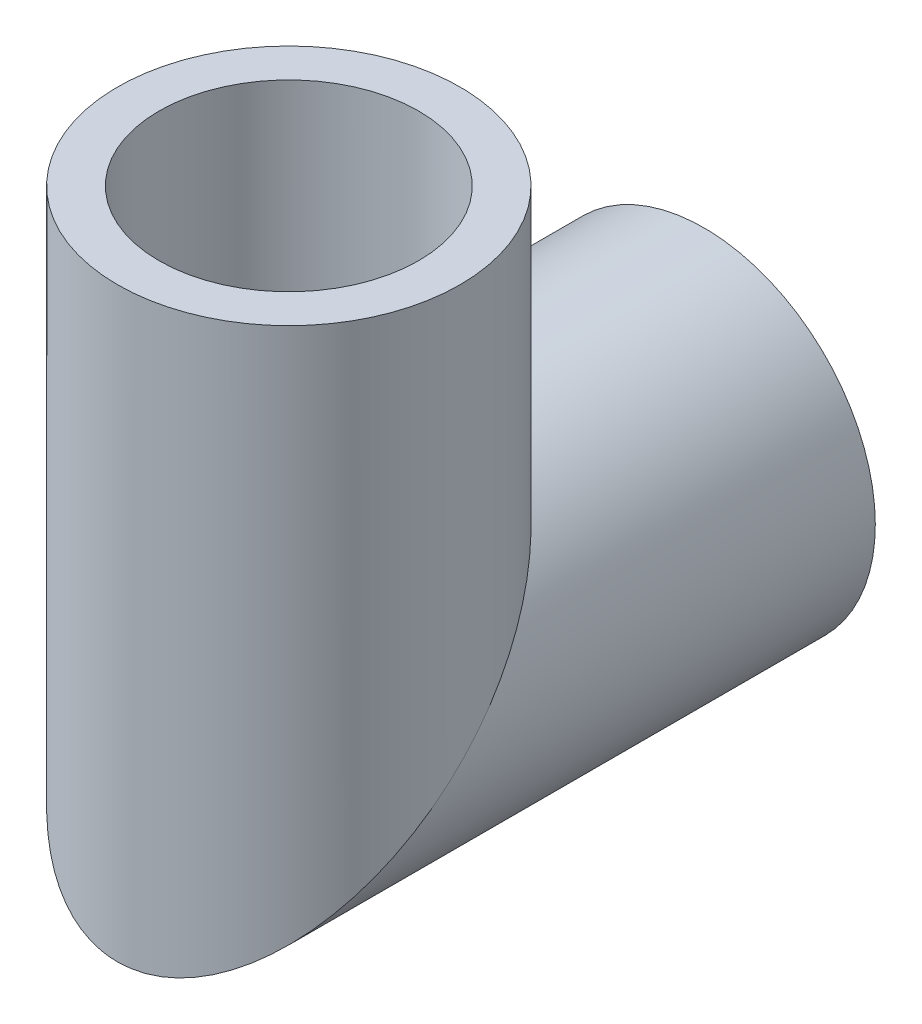
ISO-10303-21;
HEADER;
FILE_DESCRIPTION(('STEP AP214'),'2;1');
FILE_NAME('part.step','',(''),(''),'','','');
FILE_SCHEMA(('AUTOMOTIVE_DESIGN { 1 0 10303 214 1 1 1 1 }'));
ENDSEC;
DATA;
#1=APPLICATION_CONTEXT('core data for automotive mechanical design processes');
#2=APPLICATION_PROTOCOL_DEFINITION('international standard','automotive_design',2000,#1);
#3=PRODUCT_CONTEXT('',#1,'mechanical');
#4=PRODUCT('Part','Part','',(#3));
#5=PRODUCT_RELATED_PRODUCT_CATEGORY('part','',(#4));
#6=PRODUCT_DEFINITION_FORMATION('','',#4);
#7=PRODUCT_DEFINITION_CONTEXT('part definition',#1,'design');
#8=PRODUCT_DEFINITION('design','',#6,#7);
#9=PRODUCT_DEFINITION_SHAPE('','',#8);
#10=(LENGTH_UNIT() NAMED_UNIT(*) SI_UNIT(.MILLI.,.METRE.));
#11=(NAMED_UNIT(*) PLANE_ANGLE_UNIT() SI_UNIT($,.RADIAN.));
#12=(NAMED_UNIT(*) SI_UNIT($,.STERADIAN.) SOLID_ANGLE_UNIT());
#13=UNCERTAINTY_MEASURE_WITH_UNIT(LENGTH_MEASURE(1.E-05),#10,'distance_accuracy_value','');
#14=(GEOMETRIC_REPRESENTATION_CONTEXT(3) GLOBAL_UNCERTAINTY_ASSIGNED_CONTEXT((#13)) GLOBAL_UNIT_ASSIGNED_CONTEXT((#10,
#11,#12)) REPRESENTATION_CONTEXT('',''));
#15=CARTESIAN_POINT('',(0.,0.,0.));
#16=DIRECTION('',(0.,0.,1.));
#17=DIRECTION('',(1.,0.,0.));
#18=AXIS2_PLACEMENT_3D('',#15,#16,#17);
#19=CARTESIAN_POINT('',(0.,40.,40.));
#20=DIRECTION('',(0.,1.,0.));
#21=DIRECTION('',(1.,0.,0.));
#22=AXIS2_PLACEMENT_3D('',#19,#20,#21);
#23=PLANE('',#22);
#24=CARTESIAN_POINT('',(0.,40.,40.));
#25=DIRECTION('',(0.,1.,0.));
#26=DIRECTION('',(0.,0.,1.));
#27=AXIS2_PLACEMENT_3D('',#24,#25,#26);
#28=CIRCLE('',#27,12.5);
#29=CARTESIAN_POINT('',(0.,40.,52.5));
#30=VERTEX_POINT('',#29);
#31=EDGE_CURVE('E52',#30,#30,#28,.T.);
#32=ORIENTED_EDGE('',*,*,#31,.F.);
#33=EDGE_LOOP('',(#32));
#34=FACE_BOUND('',#33,.T.);
#35=CARTESIAN_POINT('',(0.,40.,40.));
#36=DIRECTION('',(0.,1.,0.));
#37=DIRECTION('',(1.,0.,0.));
#38=AXIS2_PLACEMENT_3D('',#35,#36,#37);
#39=CIRCLE('',#38,16.5);
#40=CARTESIAN_POINT('',(16.5,40.,40.));
#41=VERTEX_POINT('',#40);
#42=EDGE_CURVE('E40',#41,#41,#39,.T.);
#43=ORIENTED_EDGE('',*,*,#42,.T.);
#44=EDGE_LOOP('',(#43));
#45=FACE_BOUND('',#44,.T.);
#46=ADVANCED_FACE('F37',(#34,#45),#23,.T.);
#47=CARTESIAN_POINT('',(0.,0.,0.));
#48=DIRECTION('',(0.,0.,1.));
#49=DIRECTION('',(1.,0.,0.));
#50=AXIS2_PLACEMENT_3D('',#47,#48,#49);
#51=PLANE('',#50);
#52=CARTESIAN_POINT('',(0.,0.,0.));
#53=DIRECTION('',(0.,0.,1.));
#54=DIRECTION('',(1.,0.,0.));
#55=AXIS2_PLACEMENT_3D('',#52,#53,#54);
#56=CIRCLE('',#55,12.5);
#57=CARTESIAN_POINT('',(12.5,0.,0.));
#58=VERTEX_POINT('',#57);
#59=EDGE_CURVE('E56',#58,#58,#56,.T.);
#60=ORIENTED_EDGE('',*,*,#59,.T.);
#61=EDGE_LOOP('',(#60));
#62=FACE_BOUND('',#61,.T.);
#63=CARTESIAN_POINT('',(0.,0.,0.));
#64=DIRECTION('',(0.,0.,1.));
#65=DIRECTION('',(1.,0.,0.));
#66=AXIS2_PLACEMENT_3D('',#63,#64,#65);
#67=CIRCLE('',#66,16.5);
#68=CARTESIAN_POINT('',(16.5,0.,0.));
#69=VERTEX_POINT('',#68);
#70=EDGE_CURVE('E45',#69,#69,#67,.T.);
#71=ORIENTED_EDGE('',*,*,#70,.F.);
#72=EDGE_LOOP('',(#71));
#73=FACE_BOUND('',#72,.T.);
#74=ADVANCED_FACE('F65',(#62,#73),#51,.F.);
#75=CARTESIAN_POINT('',(0.,-36.4,40.));
#76=DIRECTION('',(0.,1.,0.));
#77=DIRECTION('',(0.,0.,1.));
#78=AXIS2_PLACEMENT_3D('',#75,#76,#77);
#79=CYLINDRICAL_SURFACE('',#78,16.5);
#80=CARTESIAN_POINT('',(0.,0.,40.));
#81=DIRECTION('',(0.,0.707106781186547,0.707106781186548));
#82=DIRECTION('',(0.,-0.707106781186548,0.707106781186547));
#83=AXIS2_PLACEMENT_3D('',#80,#81,#82);
#84=ELLIPSE('',#83,23.3345237791561,16.5);
#85=CARTESIAN_POINT('',(0.,-16.5,56.5));
#86=VERTEX_POINT('',#85);
#87=EDGE_CURVE('E10',#86,#86,#84,.F.);
#88=ORIENTED_EDGE('',*,*,#87,.F.);
#89=EDGE_LOOP('',(#88));
#90=FACE_BOUND('',#89,.T.);
#91=ORIENTED_EDGE('',*,*,#42,.F.);
#92=EDGE_LOOP('',(#91));
#93=FACE_BOUND('',#92,.T.);
#94=ADVANCED_FACE('F87',(#90,#93),#79,.T.);
#95=CARTESIAN_POINT('',(0.,0.,0.));
#96=DIRECTION('',(0.,0.,1.));
#97=DIRECTION('',(0.,-1.,0.));
#98=AXIS2_PLACEMENT_3D('',#95,#96,#97);
#99=CYLINDRICAL_SURFACE('',#98,16.5);
#100=ORIENTED_EDGE('',*,*,#70,.T.);
#101=EDGE_LOOP('',(#100));
#102=FACE_BOUND('',#101,.T.);
#103=ORIENTED_EDGE('',*,*,#87,.T.);
#104=EDGE_LOOP('',(#103));
#105=FACE_BOUND('',#104,.T.);
#106=ADVANCED_FACE('F77',(#102,#105),#99,.T.);
#107=CARTESIAN_POINT('',(0.,-27.6,40.));
#108=DIRECTION('',(0.,1.,0.));
#109=DIRECTION('',(0.,0.,1.));
#110=AXIS2_PLACEMENT_3D('',#107,#108,#109);
#111=CYLINDRICAL_SURFACE('',#110,12.5);
#112=CARTESIAN_POINT('',(0.,0.,40.));
#113=DIRECTION('',(0.,0.707106781186547,0.707106781186548));
#114=DIRECTION('',(0.,-0.707106781186548,0.707106781186547));
#115=AXIS2_PLACEMENT_3D('',#112,#113,#114);
#116=ELLIPSE('',#115,17.6776695296637,12.5);
#117=CARTESIAN_POINT('',(0.,-12.5,52.5));
#118=VERTEX_POINT('',#117);
#119=EDGE_CURVE('E57',#118,#118,#116,.T.);
#120=ORIENTED_EDGE('',*,*,#119,.F.);
#121=EDGE_LOOP('',(#120));
#122=FACE_BOUND('',#121,.T.);
#123=ORIENTED_EDGE('',*,*,#31,.T.);
#124=EDGE_LOOP('',(#123));
#125=FACE_BOUND('',#124,.T.);
#126=ADVANCED_FACE('F71',(#122,#125),#111,.F.);
#127=CARTESIAN_POINT('',(0.,0.,-3.99999999999999));
#128=DIRECTION('',(0.,0.,1.));
#129=DIRECTION('',(0.,-1.,0.));
#130=AXIS2_PLACEMENT_3D('',#127,#128,#129);
#131=CYLINDRICAL_SURFACE('',#130,12.5);
#132=ORIENTED_EDGE('',*,*,#59,.F.);
#133=EDGE_LOOP('',(#132));
#134=FACE_BOUND('',#133,.T.);
#135=ORIENTED_EDGE('',*,*,#119,.T.);
#136=EDGE_LOOP('',(#135));
#137=FACE_BOUND('',#136,.T.);
#138=ADVANCED_FACE('F68',(#134,#137),#131,.F.);
#139=CLOSED_SHELL('',(#46,#74,#94,#106,#126,#138));
#140=MANIFOLD_SOLID_BREP('B2',#139);
#141=ADVANCED_BREP_SHAPE_REPRESENTATION('',(#18,#140),#14);
#142=SHAPE_DEFINITION_REPRESENTATION(#9,#141);
ENDSEC;
END-ISO-10303-21;
